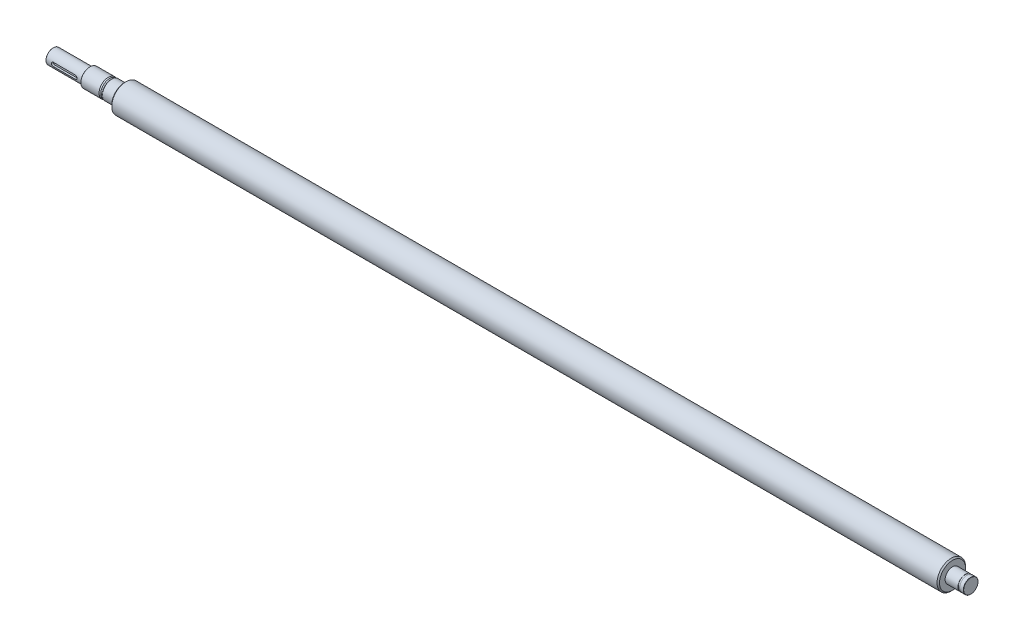
ISO-10303-21;
HEADER;
FILE_DESCRIPTION(('STEP AP214'),'2;1');
FILE_NAME('part.step','',(''),(''),'','','');
FILE_SCHEMA(('AUTOMOTIVE_DESIGN { 1 0 10303 214 1 1 1 1 }'));
ENDSEC;
DATA;
#1=APPLICATION_CONTEXT('core data for automotive mechanical design processes');
#2=APPLICATION_PROTOCOL_DEFINITION('international standard','automotive_design',2000,#1);
#3=PRODUCT_CONTEXT('',#1,'mechanical');
#4=PRODUCT('Part','Part','',(#3));
#5=PRODUCT_RELATED_PRODUCT_CATEGORY('part','',(#4));
#6=PRODUCT_DEFINITION_FORMATION('','',#4);
#7=PRODUCT_DEFINITION_CONTEXT('part definition',#1,'design');
#8=PRODUCT_DEFINITION('design','',#6,#7);
#9=PRODUCT_DEFINITION_SHAPE('','',#8);
#10=(LENGTH_UNIT() NAMED_UNIT(*) SI_UNIT(.MILLI.,.METRE.));
#11=(NAMED_UNIT(*) PLANE_ANGLE_UNIT() SI_UNIT($,.RADIAN.));
#12=(NAMED_UNIT(*) SI_UNIT($,.STERADIAN.) SOLID_ANGLE_UNIT());
#13=UNCERTAINTY_MEASURE_WITH_UNIT(LENGTH_MEASURE(1.E-05),#10,'distance_accuracy_value','');
#14=(GEOMETRIC_REPRESENTATION_CONTEXT(3) GLOBAL_UNCERTAINTY_ASSIGNED_CONTEXT((#13)) GLOBAL_UNIT_ASSIGNED_CONTEXT((#10,
#11,#12)) REPRESENTATION_CONTEXT('',''));
#15=CARTESIAN_POINT('',(0.,0.,0.));
#16=DIRECTION('',(0.,0.,1.));
#17=DIRECTION('',(1.,0.,0.));
#18=AXIS2_PLACEMENT_3D('',#15,#16,#17);
#19=CARTESIAN_POINT('',(-29.,0.,2.8));
#20=DIRECTION('',(0.,0.,1.));
#21=DIRECTION('',(1.,0.,0.));
#22=AXIS2_PLACEMENT_3D('',#19,#20,#21);
#23=PLANE('',#22);
#24=DIRECTION('',(1.,0.,0.));
#25=VECTOR('',#24,1.);
#26=CARTESIAN_POINT('',(-35.,0.9999999999,2.8));
#27=LINE('',#26,#25);
#28=CARTESIAN_POINT('',(-22.999996464466,0.9999999999,2.8));
#29=VERTEX_POINT('',#28);
#30=CARTESIAN_POINT('',(-35.,0.9999999999,2.8));
#31=VERTEX_POINT('',#30);
#32=EDGE_CURVE('E59',#29,#31,#27,.F.);
#33=ORIENTED_EDGE('',*,*,#32,.T.);
#34=CARTESIAN_POINT('',(-35.0000141421362,0.,2.8));
#35=DIRECTION('',(0.,0.,-1.));
#36=DIRECTION('',(-1.,0.,0.));
#37=AXIS2_PLACEMENT_3D('',#34,#35,#36);
#38=CIRCLE('',#37,1.);
#39=CARTESIAN_POINT('',(-35.000003535534,-0.9999999999875,2.8));
#40=VERTEX_POINT('',#39);
#41=EDGE_CURVE('E61',#31,#40,#38,.F.);
#42=ORIENTED_EDGE('',*,*,#41,.T.);
#43=DIRECTION('',(1.,0.,0.));
#44=VECTOR('',#43,1.);
#45=CARTESIAN_POINT('',(-29.,-1.,2.8));
#46=LINE('',#45,#44);
#47=CARTESIAN_POINT('',(-23.,-0.99999999995,2.8));
#48=VERTEX_POINT('',#47);
#49=EDGE_CURVE('E63',#40,#48,#46,.T.);
#50=ORIENTED_EDGE('',*,*,#49,.T.);
#51=CARTESIAN_POINT('',(-22.9999858578638,0.,2.8));
#52=DIRECTION('',(0.,0.,-1.));
#53=DIRECTION('',(-1.,0.,0.));
#54=AXIS2_PLACEMENT_3D('',#51,#52,#53);
#55=CIRCLE('',#54,1.);
#56=EDGE_CURVE('E87',#48,#29,#55,.F.);
#57=ORIENTED_EDGE('',*,*,#56,.T.);
#58=EDGE_LOOP('',(#33,#42,#50,#57));
#59=FACE_BOUND('',#58,.T.);
#60=ADVANCED_FACE('F16',(#59),#23,.T.);
#61=CARTESIAN_POINT('',(-39.,0.,1.95));
#62=DIRECTION('',(-1.,0.,0.));
#63=DIRECTION('',(0.,0.,1.));
#64=AXIS2_PLACEMENT_3D('',#61,#62,#63);
#65=PLANE('',#64);
#66=CARTESIAN_POINT('',(-38.9999999999873,0.,0.));
#67=DIRECTION('',(1.,0.,0.));
#68=DIRECTION('',(0.,0.,-1.));
#69=AXIS2_PLACEMENT_3D('',#66,#67,#68);
#70=CIRCLE('',#69,3.89999999998736);
#71=CARTESIAN_POINT('',(-38.9999999999873,0.,-3.89999999998736));
#72=VERTEX_POINT('',#71);
#73=EDGE_CURVE('E96',#72,#72,#70,.T.);
#74=ORIENTED_EDGE('',*,*,#73,.F.);
#75=EDGE_LOOP('',(#74));
#76=FACE_BOUND('',#75,.T.);
#77=ADVANCED_FACE('F490',(#76),#65,.T.);
#78=CARTESIAN_POINT('',(-29.,-1.,2.8));
#79=DIRECTION('',(0.,-1.,0.));
#80=DIRECTION('',(0.,0.,-1.));
#81=AXIS2_PLACEMENT_3D('',#78,#79,#80);
#82=PLANE('',#81);
#83=DIRECTION('',(0.,0.,-1.));
#84=VECTOR('',#83,1.);
#85=CARTESIAN_POINT('',(-23.,-0.9999999999,2.8));
#86=LINE('',#85,#84);
#87=CARTESIAN_POINT('',(-23.,-0.9999999999,3.87298334623324));
#88=VERTEX_POINT('',#87);
#89=EDGE_CURVE('E76',#88,#48,#86,.T.);
#90=ORIENTED_EDGE('',*,*,#89,.T.);
#91=ORIENTED_EDGE('',*,*,#49,.F.);
#92=DIRECTION('',(0.,0.,-1.));
#93=VECTOR('',#92,1.);
#94=CARTESIAN_POINT('',(-35.,-1.,2.8));
#95=LINE('',#94,#93);
#96=CARTESIAN_POINT('',(-35.0000141421362,-0.99999999995,3.87298334622678));
#97=VERTEX_POINT('',#96);
#98=EDGE_CURVE('E68',#40,#97,#95,.F.);
#99=ORIENTED_EDGE('',*,*,#98,.T.);
#100=DIRECTION('',(-1.,0.,0.));
#101=VECTOR('',#100,1.);
#102=CARTESIAN_POINT('',(-28.95,-0.9999999999,3.87298334623324));
#103=LINE('',#102,#101);
#104=EDGE_CURVE('E91',#88,#97,#103,.T.);
#105=ORIENTED_EDGE('',*,*,#104,.F.);
#106=EDGE_LOOP('',(#90,#91,#99,#105));
#107=FACE_BOUND('',#106,.T.);
#108=ADVANCED_FACE('F72',(#107),#82,.F.);
#109=CARTESIAN_POINT('',(-35.0000141421362,0.,2.8));
#110=DIRECTION('',(0.,0.,-1.));
#111=DIRECTION('',(-1.,0.,0.));
#112=AXIS2_PLACEMENT_3D('',#109,#110,#111);
#113=CYLINDRICAL_SURFACE('',#112,1.);
#114=ORIENTED_EDGE('',*,*,#41,.F.);
#115=DIRECTION('',(0.,0.,1.));
#116=VECTOR('',#115,1.);
#117=CARTESIAN_POINT('',(-35.,0.9999999999,2.8));
#118=LINE('',#117,#116);
#119=CARTESIAN_POINT('',(-35.,0.9999999999,3.87298334623324));
#120=VERTEX_POINT('',#119);
#121=EDGE_CURVE('E83',#31,#120,#118,.T.);
#122=ORIENTED_EDGE('',*,*,#121,.T.);
#123=CARTESIAN_POINT('',(-35.0000141421362,-0.999999999978126,3.87298334619047));
#124=CARTESIAN_POINT('',(-35.0276771040231,-1.00000033682474,3.87298148578005));
#125=CARTESIAN_POINT('',(-35.0553263587543,-0.998851408971246,3.87328009898344));
#126=CARTESIAN_POINT('',(-35.1104180853961,-0.994271305310597,3.87445904529574));
#127=CARTESIAN_POINT('',(-35.137860591315,-0.990840513521475,3.87533928052249));
#128=CARTESIAN_POINT('',(-35.2194672254802,-0.977175260841647,3.87881710393613));
#129=CARTESIAN_POINT('',(-35.2730705667485,-0.963567703684829,3.88225202756976));
#130=CARTESIAN_POINT('',(-35.3771397357222,-0.927797766665031,3.89095430304404));
#131=CARTESIAN_POINT('',(-35.4276058050904,-0.905636046676017,3.89622151353774));
#132=CARTESIAN_POINT('',(-35.5241272285646,-0.853414285079892,3.9079915748671));
#133=CARTESIAN_POINT('',(-35.570181552194,-0.823352404295455,3.9144947133322));
#134=CARTESIAN_POINT('',(-35.657553628573,-0.755487979248917,3.92816193945023));
#135=CARTESIAN_POINT('',(-35.6987607874134,-0.717545201469589,3.93533648748815));
#136=CARTESIAN_POINT('',(-35.7743094297664,-0.635284227527783,3.94944965646395));
#137=CARTESIAN_POINT('',(-35.8086484488795,-0.590963752717722,3.95638819197824));
#138=CARTESIAN_POINT('',(-35.8699405334725,-0.496434353263109,3.96936513280693));
#139=CARTESIAN_POINT('',(-35.8967805015724,-0.446150035120172,3.9753891874929));
#140=CARTESIAN_POINT('',(-35.9415576656208,-0.341642316384267,3.98572777190495));
#141=CARTESIAN_POINT('',(-35.9595055322682,-0.287423727052992,3.99004434937697));
#142=CARTESIAN_POINT('',(-35.9817702748463,-0.194111735632459,3.99546891720234));
#143=CARTESIAN_POINT('',(-35.9885999354892,-0.155632918029933,3.99715927898626));
#144=CARTESIAN_POINT('',(-35.9977226829491,-0.0781080027874523,3.99942531582632));
#145=CARTESIAN_POINT('',(-36.0000158359079,-0.0390619134266059,4.00000100713419));
#146=CARTESIAN_POINT('',(-36.0000117472211,0.0552317460204709,3.99999857595865));
#147=CARTESIAN_POINT('',(-35.9954213439112,0.110495128553125,3.99884417849277));
#148=CARTESIAN_POINT('',(-35.9772028705925,0.219452299306663,3.99434884496523));
#149=CARTESIAN_POINT('',(-35.9635661878134,0.273144540763424,3.99100582520259));
#150=CARTESIAN_POINT('',(-35.9277207198721,0.377348215861371,3.98250401526535));
#151=CARTESIAN_POINT('',(-35.9055236336074,0.427863881596435,3.97734770403179));
#152=CARTESIAN_POINT('',(-35.8532247534105,0.524450982375237,3.96576858618083));
#153=CARTESIAN_POINT('',(-35.8231231604839,0.570522530388821,3.95934581176968));
#154=CARTESIAN_POINT('',(-35.7552145046334,0.65786687164126,3.94578291721112));
#155=CARTESIAN_POINT('',(-35.7172752232677,0.699035150002468,3.93863172658058));
#156=CARTESIAN_POINT('',(-35.6350476858578,0.774497763667768,3.92449111067295));
#157=CARTESIAN_POINT('',(-35.5907584210458,0.808791004713446,3.91750171130355));
#158=CARTESIAN_POINT('',(-35.4962712982068,0.870026616122095,3.90436326577309));
#159=CARTESIAN_POINT('',(-35.4459941665044,0.896849889558466,3.89822853765251));
#160=CARTESIAN_POINT('',(-35.3414775199735,0.94160949147241,3.88766043529099));
#161=CARTESIAN_POINT('',(-35.2872410150067,0.959552491527376,3.88322578438129));
#162=CARTESIAN_POINT('',(-35.1939280572549,0.981793601637666,3.87764998113623));
#163=CARTESIAN_POINT('',(-35.1554691502136,0.98861084616514,3.87591110885318));
#164=CARTESIAN_POINT('',(-35.078013734971,0.997717159059511,3.87357281454748));
#165=CARTESIAN_POINT('',(-35.0390176342208,1.0000094875417,3.87297257217597));
#166=CARTESIAN_POINT('',(-35.,0.9999999999,3.87298334623324));
#167=B_SPLINE_CURVE_WITH_KNOTS('',3,(#123,#124,#125,#126,#127,#128,#129,#130,#131,#132,#133,
#134,#135,#136,#137,#138,#139,#140,#141,#142,#143,#144,#145,#146,#147,#148,#149,#150,#151,#152,
#153,#154,#155,#156,#157,#158,#159,#160,#161,#162,#163,#164,#165,#166),.UNSPECIFIED.,.F.,.F.,(4,
2,2,2,2,2,2,2,2,2,2,2,2,2,2,2,2,2,2,2,2,4),(0.,0.0829364608205882,0.16585896768009,
0.331229962708453,0.496588203453922,0.661984974168921,0.83062516209264,0.999325752709215,
1.17044795789428,1.34136431260919,1.45844938978497,1.57553275986339,1.74108325117617,
1.90679158624067,2.07227425740018,2.23775272086714,2.40629177067865,2.57485762457873,
2.74597444150162,2.91696250578288,3.03398745339722,3.15092805596044),.UNSPECIFIED.);
#168=EDGE_CURVE('E81',#97,#120,#167,.T.);
#169=ORIENTED_EDGE('',*,*,#168,.F.);
#170=ORIENTED_EDGE('',*,*,#98,.F.);
#171=EDGE_LOOP('',(#114,#122,#169,#170));
#172=FACE_BOUND('',#171,.T.);
#173=ADVANCED_FACE('F79',(#172),#113,.F.);
#174=CARTESIAN_POINT('',(-35.,0.9999999999,2.8));
#175=DIRECTION('',(0.,1.,0.));
#176=DIRECTION('',(0.,0.,1.));
#177=AXIS2_PLACEMENT_3D('',#174,#175,#176);
#178=PLANE('',#177);
#179=ORIENTED_EDGE('',*,*,#121,.F.);
#180=ORIENTED_EDGE('',*,*,#32,.F.);
#181=DIRECTION('',(0.,0.,1.));
#182=VECTOR('',#181,1.);
#183=CARTESIAN_POINT('',(-23.,0.9999999999,2.8));
#184=LINE('',#183,#182);
#185=CARTESIAN_POINT('',(-22.9999858578638,0.999999999925,3.87298334622678));
#186=VERTEX_POINT('',#185);
#187=EDGE_CURVE('E39',#29,#186,#184,.T.);
#188=ORIENTED_EDGE('',*,*,#187,.T.);
#189=DIRECTION('',(-1.,0.,0.));
#190=VECTOR('',#189,1.);
#191=CARTESIAN_POINT('',(-28.95,0.999999999899999,3.87298334623324));
#192=LINE('',#191,#190);
#193=EDGE_CURVE('E90',#120,#186,#192,.F.);
#194=ORIENTED_EDGE('',*,*,#193,.F.);
#195=EDGE_LOOP('',(#179,#180,#188,#194));
#196=FACE_BOUND('',#195,.T.);
#197=ADVANCED_FACE('F174',(#196),#178,.F.);
#198=CARTESIAN_POINT('',(-22.9999858578638,0.,2.8));
#199=DIRECTION('',(0.,0.,-1.));
#200=DIRECTION('',(-1.,0.,0.));
#201=AXIS2_PLACEMENT_3D('',#198,#199,#200);
#202=CYLINDRICAL_SURFACE('',#201,1.);
#203=ORIENTED_EDGE('',*,*,#56,.F.);
#204=ORIENTED_EDGE('',*,*,#89,.F.);
#205=CARTESIAN_POINT('',(-22.9999858578638,0.999999999962501,3.87298334617837));
#206=CARTESIAN_POINT('',(-22.9723228959764,1.00000033681897,3.87298148577559));
#207=CARTESIAN_POINT('',(-22.944673641245,0.998851408969631,3.87328009898223));
#208=CARTESIAN_POINT('',(-22.889581914603,0.994271305312079,3.87445904529698));
#209=CARTESIAN_POINT('',(-22.8621394086842,0.990840513521914,3.87533928052295));
#210=CARTESIAN_POINT('',(-22.7805327745195,0.97717526084046,3.87881710393531));
#211=CARTESIAN_POINT('',(-22.7269294332517,0.963567703684549,3.88225202756953));
#212=CARTESIAN_POINT('',(-22.6228602642785,0.927797766665593,3.8909543030442));
#213=CARTESIAN_POINT('',(-22.5723941949104,0.90563604667647,3.89622151353771));
#214=CARTESIAN_POINT('',(-22.4758727714364,0.853414285080377,3.90799157486692));
#215=CARTESIAN_POINT('',(-22.429818447807,0.823352404296063,3.91449471333205));
#216=CARTESIAN_POINT('',(-22.3424463714279,0.755487979249664,3.92816193945011));
#217=CARTESIAN_POINT('',(-22.3012392125874,0.717545201470345,3.93533648748801));
#218=CARTESIAN_POINT('',(-22.2256905702343,0.635284227528614,3.94944965646381));
#219=CARTESIAN_POINT('',(-22.1913515511212,0.590963752718628,3.9563881919781));
#220=CARTESIAN_POINT('',(-22.1300594665281,0.496434353264136,3.9693651328068));
#221=CARTESIAN_POINT('',(-22.1032194984281,0.446150035121241,3.97538918749278));
#222=CARTESIAN_POINT('',(-22.0584423343796,0.341642316385388,3.98572777190486));
#223=CARTESIAN_POINT('',(-22.0404944677321,0.287423727054122,3.99004434937689));
#224=CARTESIAN_POINT('',(-22.0182297251539,0.19411173563341,3.9954689172023));
#225=CARTESIAN_POINT('',(-22.0114000645109,0.155632918030695,3.99715927898624));
#226=CARTESIAN_POINT('',(-22.0022773170509,0.078108002787835,3.99942531582631));
#227=CARTESIAN_POINT('',(-21.9999841640921,0.0390619134267973,4.00000100713419));
#228=CARTESIAN_POINT('',(-21.9999882527789,-0.0552317460204703,3.99999857595865));
#229=CARTESIAN_POINT('',(-22.0045786560888,-0.110495128553124,3.99884417849277));
#230=CARTESIAN_POINT('',(-22.0227971294075,-0.219452299306662,3.99434884496523));
#231=CARTESIAN_POINT('',(-22.0364338121866,-0.273144540763424,3.99100582520259));
#232=CARTESIAN_POINT('',(-22.0722792801279,-0.377348215861373,3.98250401526534));
#233=CARTESIAN_POINT('',(-22.0944763663926,-0.427863881596438,3.97734770403179));
#234=CARTESIAN_POINT('',(-22.1467752465895,-0.52445098237524,3.96576858618083));
#235=CARTESIAN_POINT('',(-22.1768768395161,-0.570522530388824,3.95934581176968));
#236=CARTESIAN_POINT('',(-22.2447854953666,-0.657866871641262,3.94578291721112));
#237=CARTESIAN_POINT('',(-22.2827247767323,-0.69903515000247,3.93863172658058));
#238=CARTESIAN_POINT('',(-22.3649523141422,-0.774497763667771,3.92449111067295));
#239=CARTESIAN_POINT('',(-22.4092415789542,-0.80879100471345,3.91750171130355));
#240=CARTESIAN_POINT('',(-22.5037287017932,-0.870026616122098,3.90436326577309));
#241=CARTESIAN_POINT('',(-22.5540058334956,-0.896849889558469,3.89822853765251));
#242=CARTESIAN_POINT('',(-22.6585224800266,-0.941609491472412,3.88766043529099));
#243=CARTESIAN_POINT('',(-22.7127589849933,-0.959552491527378,3.88322578438129));
#244=CARTESIAN_POINT('',(-22.8060719427451,-0.981793601637668,3.87764998113623));
#245=CARTESIAN_POINT('',(-22.8445308497864,-0.988610846165141,3.87591110885318));
#246=CARTESIAN_POINT('',(-22.921986265029,-0.997717159059512,3.87357281454748));
#247=CARTESIAN_POINT('',(-22.9609823657792,-1.0000094875417,3.87297257217597));
#248=CARTESIAN_POINT('',(-23.,-0.9999999999,3.87298334623324));
#249=B_SPLINE_CURVE_WITH_KNOTS('',3,(#205,#206,#207,#208,#209,#210,#211,#212,#213,#214,#215,
#216,#217,#218,#219,#220,#221,#222,#223,#224,#225,#226,#227,#228,#229,#230,#231,#232,#233,#234,
#235,#236,#237,#238,#239,#240,#241,#242,#243,#244,#245,#246,#247,#248),.UNSPECIFIED.,.F.,.F.,(4,
2,2,2,2,2,2,2,2,2,2,2,2,2,2,2,2,2,2,2,2,4),(0.,0.0829364608209707,0.165858967680334,
0.331229962707371,0.496588203452365,0.661984974167277,0.830625162091088,0.999325752707541,
1.17044795789257,1.34136431260752,1.45844938978389,1.57553275986288,1.74108325117567,
1.90679158624017,2.07227425739969,2.23775272086664,2.40629177067815,2.57485762457824,
2.74597444150113,2.91696250578238,3.03398745339673,3.15092805595994),.UNSPECIFIED.);
#250=EDGE_CURVE('E94',#186,#88,#249,.T.);
#251=ORIENTED_EDGE('',*,*,#250,.F.);
#252=ORIENTED_EDGE('',*,*,#187,.F.);
#253=EDGE_LOOP('',(#203,#204,#251,#252));
#254=FACE_BOUND('',#253,.T.);
#255=ADVANCED_FACE('F156',(#254),#202,.F.);
#256=CARTESIAN_POINT('',(-38.8999999999555,0.,0.));
#257=DIRECTION('',(1.,0.,0.));
#258=DIRECTION('',(0.,0.,-1.));
#259=AXIS2_PLACEMENT_3D('',#256,#257,#258);
#260=CONICAL_SURFACE('',#259,3.99999999996226,0.785398163113231);
#261=CARTESIAN_POINT('',(-38.9,0.,0.));
#262=DIRECTION('',(-1.,0.,0.));
#263=DIRECTION('',(0.,0.,1.));
#264=AXIS2_PLACEMENT_3D('',#261,#262,#263);
#265=CIRCLE('',#264,4.);
#266=CARTESIAN_POINT('',(-38.9,0.,4.));
#267=VERTEX_POINT('',#266);
#268=EDGE_CURVE('E105',#267,#267,#265,.F.);
#269=ORIENTED_EDGE('',*,*,#268,.F.);
#270=EDGE_LOOP('',(#269));
#271=FACE_BOUND('',#270,.T.);
#272=ORIENTED_EDGE('',*,*,#73,.T.);
#273=EDGE_LOOP('',(#272));
#274=FACE_BOUND('',#273,.T.);
#275=ADVANCED_FACE('F165',(#271,#274),#260,.T.);
#276=CARTESIAN_POINT('',(-28.95,0.,0.));
#277=DIRECTION('',(-1.,0.,0.));
#278=DIRECTION('',(0.,0.,1.));
#279=AXIS2_PLACEMENT_3D('',#276,#277,#278);
#280=CYLINDRICAL_SURFACE('',#279,4.);
#281=ORIENTED_EDGE('',*,*,#104,.T.);
#282=ORIENTED_EDGE('',*,*,#168,.T.);
#283=ORIENTED_EDGE('',*,*,#193,.T.);
#284=ORIENTED_EDGE('',*,*,#250,.T.);
#285=EDGE_LOOP('',(#281,#282,#283,#284));
#286=FACE_BOUND('',#285,.T.);
#287=CARTESIAN_POINT('',(-19.,0.,0.));
#288=DIRECTION('',(-1.,0.,0.));
#289=DIRECTION('',(0.,0.,1.));
#290=AXIS2_PLACEMENT_3D('',#287,#288,#289);
#291=CIRCLE('',#290,4.);
#292=CARTESIAN_POINT('',(-19.,0.,4.));
#293=VERTEX_POINT('',#292);
#294=EDGE_CURVE('E108',#293,#293,#291,.F.);
#295=ORIENTED_EDGE('',*,*,#294,.F.);
#296=EDGE_LOOP('',(#295));
#297=FACE_BOUND('',#296,.T.);
#298=ORIENTED_EDGE('',*,*,#268,.T.);
#299=EDGE_LOOP('',(#298));
#300=FACE_BOUND('',#299,.T.);
#301=ADVANCED_FACE('F160',(#286,#297,#300),#280,.T.);
#302=CARTESIAN_POINT('',(-19.,0.,4.45));
#303=DIRECTION('',(-1.,0.,0.));
#304=DIRECTION('',(0.,0.,1.));
#305=AXIS2_PLACEMENT_3D('',#302,#303,#304);
#306=PLANE('',#305);
#307=ORIENTED_EDGE('',*,*,#294,.T.);
#308=EDGE_LOOP('',(#307));
#309=FACE_BOUND('',#308,.T.);
#310=CARTESIAN_POINT('',(-19.0000000000055,0.,0.));
#311=DIRECTION('',(1.,0.,0.));
#312=DIRECTION('',(0.,0.,-1.));
#313=AXIS2_PLACEMENT_3D('',#310,#311,#312);
#314=CIRCLE('',#313,4.90000000002055);
#315=CARTESIAN_POINT('',(-19.0000000000055,0.,-4.90000000002055));
#316=VERTEX_POINT('',#315);
#317=EDGE_CURVE('E144',#316,#316,#314,.T.);
#318=ORIENTED_EDGE('',*,*,#317,.F.);
#319=EDGE_LOOP('',(#318));
#320=FACE_BOUND('',#319,.T.);
#321=ADVANCED_FACE('F164',(#309,#320),#306,.T.);
#322=CARTESIAN_POINT('',(-18.9000000000874,0.,0.));
#323=DIRECTION('',(1.,0.,0.));
#324=DIRECTION('',(0.,0.,-1.));
#325=AXIS2_PLACEMENT_3D('',#322,#323,#324);
#326=CONICAL_SURFACE('',#325,4.99999999999545,0.785398163681665);
#327=ORIENTED_EDGE('',*,*,#317,.T.);
#328=EDGE_LOOP('',(#327));
#329=FACE_BOUND('',#328,.T.);
#330=CARTESIAN_POINT('',(-18.9,0.,0.));
#331=DIRECTION('',(-1.,0.,0.));
#332=DIRECTION('',(0.,0.,1.));
#333=AXIS2_PLACEMENT_3D('',#330,#331,#332);
#334=CIRCLE('',#333,5.);
#335=CARTESIAN_POINT('',(-18.9,0.,5.));
#336=VERTEX_POINT('',#335);
#337=EDGE_CURVE('E143',#336,#336,#334,.F.);
#338=ORIENTED_EDGE('',*,*,#337,.F.);
#339=EDGE_LOOP('',(#338));
#340=FACE_BOUND('',#339,.T.);
#341=ADVANCED_FACE('F249',(#329,#340),#326,.T.);
#342=CARTESIAN_POINT('',(461.,0.,-1.95));
#343=DIRECTION('',(1.,0.,0.));
#344=DIRECTION('',(0.,0.,-1.));
#345=AXIS2_PLACEMENT_3D('',#342,#343,#344);
#346=PLANE('',#345);
#347=CARTESIAN_POINT('',(461.000000000013,0.,0.));
#348=DIRECTION('',(-1.,0.,0.));
#349=DIRECTION('',(0.,-1.,0.));
#350=AXIS2_PLACEMENT_3D('',#347,#348,#349);
#351=CIRCLE('',#350,3.89999999998736);
#352=CARTESIAN_POINT('',(461.000000000013,-3.89999999998736,0.));
#353=VERTEX_POINT('',#352);
#354=EDGE_CURVE('E139',#353,#353,#351,.T.);
#355=ORIENTED_EDGE('',*,*,#354,.F.);
#356=EDGE_LOOP('',(#355));
#357=FACE_BOUND('',#356,.T.);
#358=ADVANCED_FACE('F251',(#357),#346,.T.);
#359=CARTESIAN_POINT('',(-3.5,0.,0.));
#360=DIRECTION('',(-1.,0.,0.));
#361=DIRECTION('',(0.,0.,1.));
#362=AXIS2_PLACEMENT_3D('',#359,#360,#361);
#363=CYLINDRICAL_SURFACE('',#362,5.);
#364=ORIENTED_EDGE('',*,*,#337,.T.);
#365=EDGE_LOOP('',(#364));
#366=FACE_BOUND('',#365,.T.);
#367=CARTESIAN_POINT('',(-8.99999999995771,0.,0.));
#368=DIRECTION('',(-1.,0.,0.));
#369=DIRECTION('',(0.,0.,-1.));
#370=AXIS2_PLACEMENT_3D('',#367,#368,#369);
#371=CIRCLE('',#370,4.99999999996703);
#372=CARTESIAN_POINT('',(-8.99999999995771,0.,-4.99999999996703));
#373=VERTEX_POINT('',#372);
#374=EDGE_CURVE('E142',#373,#373,#371,.F.);
#375=ORIENTED_EDGE('',*,*,#374,.F.);
#376=EDGE_LOOP('',(#375));
#377=FACE_BOUND('',#376,.T.);
#378=ADVANCED_FACE('F246',(#366,#377),#363,.T.);
#379=CARTESIAN_POINT('',(460.900000000095,0.,0.));
#380=DIRECTION('',(-1.,0.,0.));
#381=DIRECTION('',(0.,-1.,0.));
#382=AXIS2_PLACEMENT_3D('',#379,#380,#381);
#383=CONICAL_SURFACE('',#382,3.99999999990541,0.785398163397448);
#384=ORIENTED_EDGE('',*,*,#354,.T.);
#385=EDGE_LOOP('',(#384));
#386=FACE_BOUND('',#385,.T.);
#387=CARTESIAN_POINT('',(460.9,0.,0.));
#388=DIRECTION('',(-1.,0.,0.));
#389=DIRECTION('',(0.,0.,1.));
#390=AXIS2_PLACEMENT_3D('',#387,#388,#389);
#391=CIRCLE('',#390,4.);
#392=CARTESIAN_POINT('',(460.9,0.,4.));
#393=VERTEX_POINT('',#392);
#394=EDGE_CURVE('E238',#393,#393,#391,.T.);
#395=ORIENTED_EDGE('',*,*,#394,.F.);
#396=EDGE_LOOP('',(#395));
#397=FACE_BOUND('',#396,.T.);
#398=ADVANCED_FACE('F263',(#386,#397),#383,.T.);
#399=CARTESIAN_POINT('',(-8.99999999995771,0.,0.));
#400=DIRECTION('',(-1.,0.,0.));
#401=DIRECTION('',(0.,0.,1.));
#402=AXIS2_PLACEMENT_3D('',#399,#400,#401);
#403=CONICAL_SURFACE('',#402,4.99999999996703,0.261799387787018);
#404=CARTESIAN_POINT('',(-8.25358983848622,0.,0.));
#405=DIRECTION('',(1.,0.,0.));
#406=DIRECTION('',(0.,0.,-1.));
#407=AXIS2_PLACEMENT_3D('',#404,#405,#406);
#408=CIRCLE('',#407,4.8);
#409=CARTESIAN_POINT('',(-8.25358983848622,0.,-4.8));
#410=VERTEX_POINT('',#409);
#411=EDGE_CURVE('E138',#410,#410,#408,.T.);
#412=ORIENTED_EDGE('',*,*,#411,.F.);
#413=EDGE_LOOP('',(#412));
#414=FACE_BOUND('',#413,.T.);
#415=ORIENTED_EDGE('',*,*,#374,.T.);
#416=EDGE_LOOP('',(#415));
#417=FACE_BOUND('',#416,.T.);
#418=ADVANCED_FACE('F266',(#414,#417),#403,.T.);
#419=CARTESIAN_POINT('',(459.9,0.,0.));
#420=DIRECTION('',(-1.,0.,0.));
#421=DIRECTION('',(0.,0.,1.));
#422=AXIS2_PLACEMENT_3D('',#419,#420,#421);
#423=CYLINDRICAL_SURFACE('',#422,4.);
#424=ORIENTED_EDGE('',*,*,#394,.T.);
#425=EDGE_LOOP('',(#424));
#426=FACE_BOUND('',#425,.T.);
#427=CARTESIAN_POINT('',(458.9,0.,0.));
#428=DIRECTION('',(-1.,0.,0.));
#429=DIRECTION('',(0.,0.,1.));
#430=AXIS2_PLACEMENT_3D('',#427,#428,#429);
#431=CIRCLE('',#430,4.);
#432=CARTESIAN_POINT('',(458.9,0.,4.));
#433=VERTEX_POINT('',#432);
#434=EDGE_CURVE('E135',#433,#433,#431,.T.);
#435=ORIENTED_EDGE('',*,*,#434,.F.);
#436=EDGE_LOOP('',(#435));
#437=FACE_BOUND('',#436,.T.);
#438=ADVANCED_FACE('F270',(#426,#437),#423,.T.);
#439=CARTESIAN_POINT('',(-7.92679491924311,0.,0.));
#440=DIRECTION('',(1.,0.,0.));
#441=DIRECTION('',(0.,0.,-1.));
#442=AXIS2_PLACEMENT_3D('',#439,#440,#441);
#443=CYLINDRICAL_SURFACE('',#442,4.8);
#444=CARTESIAN_POINT('',(-7.6,0.,0.));
#445=DIRECTION('',(-1.,0.,0.));
#446=DIRECTION('',(0.,0.,1.));
#447=AXIS2_PLACEMENT_3D('',#444,#445,#446);
#448=CIRCLE('',#447,4.8);
#449=CARTESIAN_POINT('',(-7.6,0.,4.8));
#450=VERTEX_POINT('',#449);
#451=EDGE_CURVE('E134',#450,#450,#448,.T.);
#452=ORIENTED_EDGE('',*,*,#451,.T.);
#453=EDGE_LOOP('',(#452));
#454=FACE_BOUND('',#453,.T.);
#455=ORIENTED_EDGE('',*,*,#411,.T.);
#456=EDGE_LOOP('',(#455));
#457=FACE_BOUND('',#456,.T.);
#458=ADVANCED_FACE('F273',(#454,#457),#443,.T.);
#459=CARTESIAN_POINT('',(458.9,0.,-3.925));
#460=DIRECTION('',(-1.,0.,0.));
#461=DIRECTION('',(0.,0.,1.));
#462=AXIS2_PLACEMENT_3D('',#459,#460,#461);
#463=PLANE('',#462);
#464=CARTESIAN_POINT('',(458.9,0.,0.));
#465=DIRECTION('',(-1.,0.,0.));
#466=DIRECTION('',(0.,0.,1.));
#467=AXIS2_PLACEMENT_3D('',#464,#465,#466);
#468=CIRCLE('',#467,3.85);
#469=CARTESIAN_POINT('',(458.9,0.,3.85));
#470=VERTEX_POINT('',#469);
#471=EDGE_CURVE('E131',#470,#470,#468,.T.);
#472=ORIENTED_EDGE('',*,*,#471,.F.);
#473=EDGE_LOOP('',(#472));
#474=FACE_BOUND('',#473,.T.);
#475=ORIENTED_EDGE('',*,*,#434,.T.);
#476=EDGE_LOOP('',(#475));
#477=FACE_BOUND('',#476,.T.);
#478=ADVANCED_FACE('F227',(#474,#477),#463,.T.);
#479=CARTESIAN_POINT('',(-7.6,0.,0.));
#480=DIRECTION('',(-1.,0.,0.));
#481=DIRECTION('',(0.,0.,1.));
#482=AXIS2_PLACEMENT_3D('',#479,#480,#481);
#483=TOROIDAL_SURFACE('',#482,5.4,0.6);
#484=ORIENTED_EDGE('',*,*,#451,.F.);
#485=EDGE_LOOP('',(#484));
#486=FACE_BOUND('',#485,.T.);
#487=CARTESIAN_POINT('',(-7.15278640450004,0.,0.));
#488=DIRECTION('',(-1.,0.,0.));
#489=DIRECTION('',(0.,0.,1.));
#490=AXIS2_PLACEMENT_3D('',#487,#488,#489);
#491=CIRCLE('',#490,5.);
#492=CARTESIAN_POINT('',(-7.15278640450004,0.,5.));
#493=VERTEX_POINT('',#492);
#494=EDGE_CURVE('E130',#493,#493,#491,.F.);
#495=ORIENTED_EDGE('',*,*,#494,.F.);
#496=EDGE_LOOP('',(#495));
#497=FACE_BOUND('',#496,.T.);
#498=ADVANCED_FACE('F222',(#486,#497),#483,.F.);
#499=CARTESIAN_POINT('',(458.45,0.,0.));
#500=DIRECTION('',(-1.,0.,0.));
#501=DIRECTION('',(0.,0.,1.));
#502=AXIS2_PLACEMENT_3D('',#499,#500,#501);
#503=CYLINDRICAL_SURFACE('',#502,3.85);
#504=ORIENTED_EDGE('',*,*,#471,.T.);
#505=EDGE_LOOP('',(#504));
#506=FACE_BOUND('',#505,.T.);
#507=CARTESIAN_POINT('',(458.,0.,0.));
#508=DIRECTION('',(-1.,0.,0.));
#509=DIRECTION('',(0.,0.,1.));
#510=AXIS2_PLACEMENT_3D('',#507,#508,#509);
#511=CIRCLE('',#510,3.85);
#512=CARTESIAN_POINT('',(458.,0.,3.85));
#513=VERTEX_POINT('',#512);
#514=EDGE_CURVE('E127',#513,#513,#511,.T.);
#515=ORIENTED_EDGE('',*,*,#514,.F.);
#516=EDGE_LOOP('',(#515));
#517=FACE_BOUND('',#516,.T.);
#518=ADVANCED_FACE('F218',(#506,#517),#503,.T.);
#519=CARTESIAN_POINT('',(-3.5,0.,0.));
#520=DIRECTION('',(-1.,0.,0.));
#521=DIRECTION('',(0.,0.,1.));
#522=AXIS2_PLACEMENT_3D('',#519,#520,#521);
#523=CYLINDRICAL_SURFACE('',#522,5.);
#524=ORIENTED_EDGE('',*,*,#494,.T.);
#525=EDGE_LOOP('',(#524));
#526=FACE_BOUND('',#525,.T.);
#527=CARTESIAN_POINT('',(-0.746410161525546,0.,0.));
#528=DIRECTION('',(-1.,0.,0.));
#529=DIRECTION('',(0.,0.,-1.));
#530=AXIS2_PLACEMENT_3D('',#527,#528,#529);
#531=CIRCLE('',#530,4.99999999999545);
#532=CARTESIAN_POINT('',(-0.746410161525546,0.,-4.99999999999545));
#533=VERTEX_POINT('',#532);
#534=EDGE_CURVE('E126',#533,#533,#531,.F.);
#535=ORIENTED_EDGE('',*,*,#534,.F.);
#536=EDGE_LOOP('',(#535));
#537=FACE_BOUND('',#536,.T.);
#538=ADVANCED_FACE('F214',(#526,#537),#523,.T.);
#539=CARTESIAN_POINT('',(458.,0.,-3.925));
#540=DIRECTION('',(1.,0.,0.));
#541=DIRECTION('',(0.,0.,-1.));
#542=AXIS2_PLACEMENT_3D('',#539,#540,#541);
#543=PLANE('',#542);
#544=CARTESIAN_POINT('',(458.,0.,0.));
#545=DIRECTION('',(-1.,0.,0.));
#546=DIRECTION('',(0.,0.,1.));
#547=AXIS2_PLACEMENT_3D('',#544,#545,#546);
#548=CIRCLE('',#547,4.);
#549=CARTESIAN_POINT('',(458.,0.,4.));
#550=VERTEX_POINT('',#549);
#551=EDGE_CURVE('E123',#550,#550,#548,.T.);
#552=ORIENTED_EDGE('',*,*,#551,.F.);
#553=EDGE_LOOP('',(#552));
#554=FACE_BOUND('',#553,.T.);
#555=ORIENTED_EDGE('',*,*,#514,.T.);
#556=EDGE_LOOP('',(#555));
#557=FACE_BOUND('',#556,.T.);
#558=ADVANCED_FACE('F210',(#554,#557),#543,.T.);
#559=CARTESIAN_POINT('',(-0.746410161525546,0.,0.));
#560=DIRECTION('',(-1.,0.,0.));
#561=DIRECTION('',(0.,-1.,0.));
#562=AXIS2_PLACEMENT_3D('',#559,#560,#561);
#563=CONICAL_SURFACE('',#562,4.99999999999545,0.261799387784467);
#564=CARTESIAN_POINT('',(5.6843418860808E-11,0.,0.));
#565=DIRECTION('',(-1.,0.,0.));
#566=DIRECTION('',(0.,-1.,0.));
#567=AXIS2_PLACEMENT_3D('',#564,#565,#566);
#568=CIRCLE('',#567,4.79999999998881);
#569=CARTESIAN_POINT('',(5.68434709025123E-11,-4.79999999998881,0.));
#570=VERTEX_POINT('',#569);
#571=EDGE_CURVE('E120',#570,#570,#568,.F.);
#572=ORIENTED_EDGE('',*,*,#571,.F.);
#573=EDGE_LOOP('',(#572));
#574=FACE_BOUND('',#573,.T.);
#575=ORIENTED_EDGE('',*,*,#534,.T.);
#576=EDGE_LOOP('',(#575));
#577=FACE_BOUND('',#576,.T.);
#578=ADVANCED_FACE('F206',(#574,#577),#563,.T.);
#579=CARTESIAN_POINT('',(454.5,0.,0.));
#580=DIRECTION('',(-1.,0.,0.));
#581=DIRECTION('',(0.,0.,1.));
#582=AXIS2_PLACEMENT_3D('',#579,#580,#581);
#583=CYLINDRICAL_SURFACE('',#582,4.);
#584=CARTESIAN_POINT('',(451.,0.,0.));
#585=DIRECTION('',(-1.,0.,0.));
#586=DIRECTION('',(0.,0.,1.));
#587=AXIS2_PLACEMENT_3D('',#584,#585,#586);
#588=CIRCLE('',#587,4.);
#589=CARTESIAN_POINT('',(451.,0.,4.));
#590=VERTEX_POINT('',#589);
#591=EDGE_CURVE('E117',#590,#590,#588,.T.);
#592=ORIENTED_EDGE('',*,*,#591,.F.);
#593=EDGE_LOOP('',(#592));
#594=FACE_BOUND('',#593,.T.);
#595=ORIENTED_EDGE('',*,*,#551,.T.);
#596=EDGE_LOOP('',(#595));
#597=FACE_BOUND('',#596,.T.);
#598=ADVANCED_FACE('F202',(#594,#597),#583,.T.);
#599=CARTESIAN_POINT('',(0.,0.,-3.5375));
#600=DIRECTION('',(-1.,0.,0.));
#601=DIRECTION('',(0.,0.,1.));
#602=AXIS2_PLACEMENT_3D('',#599,#600,#601);
#603=PLANE('',#602);
#604=CARTESIAN_POINT('',(0.,0.,0.));
#605=DIRECTION('',(1.,0.,0.));
#606=DIRECTION('',(0.,0.,-1.));
#607=AXIS2_PLACEMENT_3D('',#604,#605,#606);
#608=CIRCLE('',#607,7.07500000000001);
#609=CARTESIAN_POINT('',(0.,0.,-7.07500000000001));
#610=VERTEX_POINT('',#609);
#611=EDGE_CURVE('E114',#610,#610,#608,.T.);
#612=ORIENTED_EDGE('',*,*,#611,.F.);
#613=EDGE_LOOP('',(#612));
#614=FACE_BOUND('',#613,.T.);
#615=ORIENTED_EDGE('',*,*,#571,.T.);
#616=EDGE_LOOP('',(#615));
#617=FACE_BOUND('',#616,.T.);
#618=ADVANCED_FACE('F198',(#614,#617),#603,.T.);
#619=CARTESIAN_POINT('',(451.,0.,-3.5375));
#620=DIRECTION('',(1.,0.,0.));
#621=DIRECTION('',(0.,0.,-1.));
#622=AXIS2_PLACEMENT_3D('',#619,#620,#621);
#623=PLANE('',#622);
#624=CARTESIAN_POINT('',(451.,0.,0.));
#625=DIRECTION('',(-1.,0.,0.));
#626=DIRECTION('',(0.,0.,1.));
#627=AXIS2_PLACEMENT_3D('',#624,#625,#626);
#628=CIRCLE('',#627,7.07500000000001);
#629=CARTESIAN_POINT('',(451.,0.,7.07500000000001));
#630=VERTEX_POINT('',#629);
#631=EDGE_CURVE('E111',#630,#630,#628,.T.);
#632=ORIENTED_EDGE('',*,*,#631,.F.);
#633=EDGE_LOOP('',(#632));
#634=FACE_BOUND('',#633,.T.);
#635=ORIENTED_EDGE('',*,*,#591,.T.);
#636=EDGE_LOOP('',(#635));
#637=FACE_BOUND('',#636,.T.);
#638=ADVANCED_FACE('F194',(#634,#637),#623,.T.);
#639=CARTESIAN_POINT('',(0.674999999999997,0.,0.));
#640=DIRECTION('',(1.,0.,0.));
#641=DIRECTION('',(0.,0.,-1.));
#642=AXIS2_PLACEMENT_3D('',#639,#640,#641);
#643=CONICAL_SURFACE('',#642,7.75000000000001,0.78539816339744);
#644=ORIENTED_EDGE('',*,*,#611,.T.);
#645=EDGE_LOOP('',(#644));
#646=FACE_BOUND('',#645,.T.);
#647=CARTESIAN_POINT('',(0.675000000000009,0.,0.));
#648=DIRECTION('',(-1.,0.,0.));
#649=DIRECTION('',(0.,0.,1.));
#650=AXIS2_PLACEMENT_3D('',#647,#648,#649);
#651=CIRCLE('',#650,7.75);
#652=CARTESIAN_POINT('',(0.675000000000009,0.,7.75));
#653=VERTEX_POINT('',#652);
#654=EDGE_CURVE('E30',#653,#653,#651,.F.);
#655=ORIENTED_EDGE('',*,*,#654,.F.);
#656=EDGE_LOOP('',(#655));
#657=FACE_BOUND('',#656,.T.);
#658=ADVANCED_FACE('F186',(#646,#657),#643,.T.);
#659=CARTESIAN_POINT('',(450.325,0.,0.));
#660=DIRECTION('',(-1.,0.,0.));
#661=DIRECTION('',(0.,0.,1.));
#662=AXIS2_PLACEMENT_3D('',#659,#660,#661);
#663=CONICAL_SURFACE('',#662,7.75000000000005,0.78539816339745);
#664=ORIENTED_EDGE('',*,*,#631,.T.);
#665=EDGE_LOOP('',(#664));
#666=FACE_BOUND('',#665,.T.);
#667=CARTESIAN_POINT('',(450.325,0.,0.));
#668=DIRECTION('',(-1.,0.,0.));
#669=DIRECTION('',(0.,0.,1.));
#670=AXIS2_PLACEMENT_3D('',#667,#668,#669);
#671=CIRCLE('',#670,7.75);
#672=CARTESIAN_POINT('',(450.325,0.,7.75));
#673=VERTEX_POINT('',#672);
#674=EDGE_CURVE('E11',#673,#673,#671,.T.);
#675=ORIENTED_EDGE('',*,*,#674,.F.);
#676=EDGE_LOOP('',(#675));
#677=FACE_BOUND('',#676,.T.);
#678=ADVANCED_FACE('F180',(#666,#677),#663,.T.);
#679=CARTESIAN_POINT('',(225.5,0.,0.));
#680=DIRECTION('',(-1.,0.,0.));
#681=DIRECTION('',(0.,0.,1.));
#682=AXIS2_PLACEMENT_3D('',#679,#680,#681);
#683=CYLINDRICAL_SURFACE('',#682,7.75);
#684=ORIENTED_EDGE('',*,*,#654,.T.);
#685=EDGE_LOOP('',(#684));
#686=FACE_BOUND('',#685,.T.);
#687=ORIENTED_EDGE('',*,*,#674,.T.);
#688=EDGE_LOOP('',(#687));
#689=FACE_BOUND('',#688,.T.);
#690=ADVANCED_FACE('F178',(#686,#689),#683,.T.);
#691=CLOSED_SHELL('',(#60,#77,#108,#173,#197,#255,#275,#301,#321,#341,#358,#378,#398,#418,#438,
#458,#478,#498,#518,#538,#558,#578,#598,#618,#638,#658,#678,#690));
#692=MANIFOLD_SOLID_BREP('B1',#691);
#693=ADVANCED_BREP_SHAPE_REPRESENTATION('',(#18,#692),#14);
#694=SHAPE_DEFINITION_REPRESENTATION(#9,#693);
ENDSEC;
END-ISO-10303-21;
